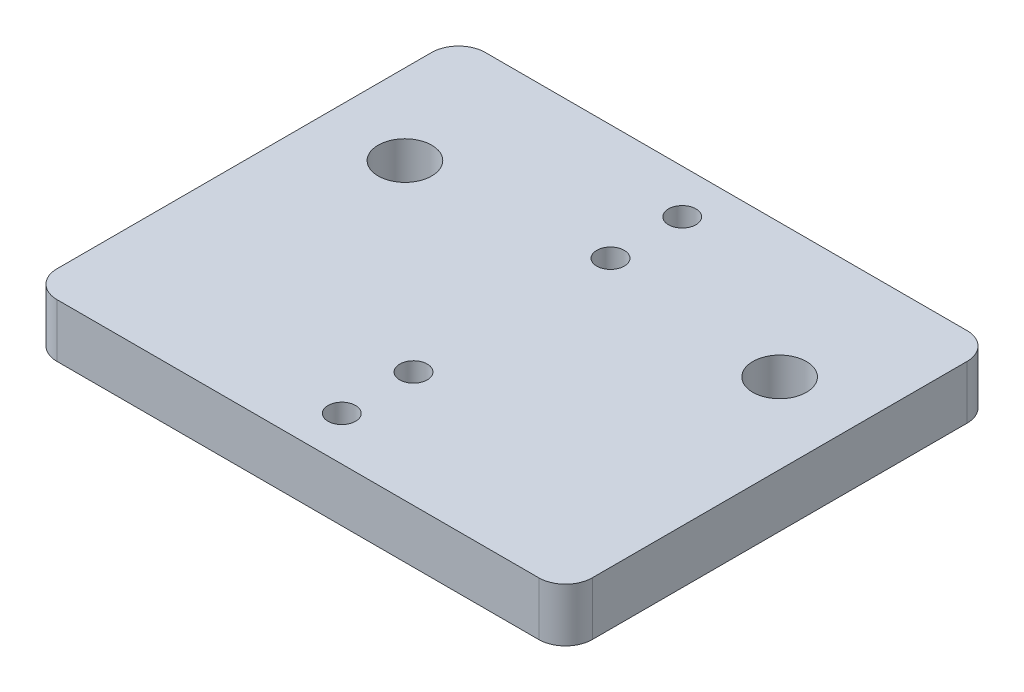
ISO-10303-21;
HEADER;
FILE_DESCRIPTION(('STEP AP214'),'2;1');
FILE_NAME('part.step','',(''),(''),'','','');
FILE_SCHEMA(('AUTOMOTIVE_DESIGN { 1 0 10303 214 1 1 1 1 }'));
ENDSEC;
DATA;
#1=APPLICATION_CONTEXT('core data for automotive mechanical design processes');
#2=APPLICATION_PROTOCOL_DEFINITION('international standard','automotive_design',2000,#1);
#3=PRODUCT_CONTEXT('',#1,'mechanical');
#4=PRODUCT('Part','Part','',(#3));
#5=PRODUCT_RELATED_PRODUCT_CATEGORY('part','',(#4));
#6=PRODUCT_DEFINITION_FORMATION('','',#4);
#7=PRODUCT_DEFINITION_CONTEXT('part definition',#1,'design');
#8=PRODUCT_DEFINITION('design','',#6,#7);
#9=PRODUCT_DEFINITION_SHAPE('','',#8);
#10=(LENGTH_UNIT() NAMED_UNIT(*) SI_UNIT(.MILLI.,.METRE.));
#11=(NAMED_UNIT(*) PLANE_ANGLE_UNIT() SI_UNIT($,.RADIAN.));
#12=(NAMED_UNIT(*) SI_UNIT($,.STERADIAN.) SOLID_ANGLE_UNIT());
#13=UNCERTAINTY_MEASURE_WITH_UNIT(LENGTH_MEASURE(1.E-05),#10,'distance_accuracy_value','');
#14=(GEOMETRIC_REPRESENTATION_CONTEXT(3) GLOBAL_UNCERTAINTY_ASSIGNED_CONTEXT((#13)) GLOBAL_UNIT_ASSIGNED_CONTEXT((#10,
#11,#12)) REPRESENTATION_CONTEXT('',''));
#15=CARTESIAN_POINT('',(0.,0.,0.));
#16=DIRECTION('',(0.,0.,1.));
#17=DIRECTION('',(1.,0.,0.));
#18=AXIS2_PLACEMENT_3D('',#15,#16,#17);
#19=CARTESIAN_POINT('',(0.,6.35,0.));
#20=DIRECTION('',(0.,-1.,0.));
#21=DIRECTION('',(0.,0.,-1.));
#22=AXIS2_PLACEMENT_3D('',#19,#20,#21);
#23=PLANE('',#22);
#24=DIRECTION('',(-1.,0.,0.));
#25=VECTOR('',#24,1.);
#26=CARTESIAN_POINT('',(-63.5,6.35,-50.8));
#27=LINE('',#26,#25);
#28=CARTESIAN_POINT('',(57.15,6.35,-50.8));
#29=VERTEX_POINT('',#28);
#30=CARTESIAN_POINT('',(-57.15,6.35,-50.8));
#31=VERTEX_POINT('',#30);
#32=EDGE_CURVE('E168',#29,#31,#27,.T.);
#33=ORIENTED_EDGE('',*,*,#32,.T.);
#34=CARTESIAN_POINT('',(-57.15,6.35,-44.45));
#35=DIRECTION('',(0.,-1.,0.));
#36=DIRECTION('',(0.,0.,-1.));
#37=AXIS2_PLACEMENT_3D('',#34,#35,#36);
#38=CIRCLE('',#37,6.35);
#39=CARTESIAN_POINT('',(-63.5,6.35,-44.45));
#40=VERTEX_POINT('',#39);
#41=EDGE_CURVE('E146',#31,#40,#38,.F.);
#42=ORIENTED_EDGE('',*,*,#41,.T.);
#43=DIRECTION('',(0.,0.,1.));
#44=VECTOR('',#43,1.);
#45=CARTESIAN_POINT('',(-63.5,6.35,50.8));
#46=LINE('',#45,#44);
#47=CARTESIAN_POINT('',(-63.5,6.35,44.45));
#48=VERTEX_POINT('',#47);
#49=EDGE_CURVE('E116',#40,#48,#46,.T.);
#50=ORIENTED_EDGE('',*,*,#49,.T.);
#51=CARTESIAN_POINT('',(-57.15,6.35,44.45));
#52=DIRECTION('',(0.,-1.,0.));
#53=DIRECTION('',(0.,0.,-1.));
#54=AXIS2_PLACEMENT_3D('',#51,#52,#53);
#55=CIRCLE('',#54,6.35);
#56=CARTESIAN_POINT('',(-57.15,6.35,50.8));
#57=VERTEX_POINT('',#56);
#58=EDGE_CURVE('E52',#48,#57,#55,.F.);
#59=ORIENTED_EDGE('',*,*,#58,.T.);
#60=DIRECTION('',(1.,0.,0.));
#61=VECTOR('',#60,1.);
#62=CARTESIAN_POINT('',(-63.5,6.35,50.8));
#63=LINE('',#62,#61);
#64=CARTESIAN_POINT('',(57.1499999999999,6.35,50.8));
#65=VERTEX_POINT('',#64);
#66=EDGE_CURVE('E132',#57,#65,#63,.T.);
#67=ORIENTED_EDGE('',*,*,#66,.T.);
#68=CARTESIAN_POINT('',(57.15,6.35,44.45));
#69=DIRECTION('',(0.,-1.,0.));
#70=DIRECTION('',(0.,0.,-1.));
#71=AXIS2_PLACEMENT_3D('',#68,#69,#70);
#72=CIRCLE('',#71,6.35);
#73=CARTESIAN_POINT('',(63.5,6.35,44.45));
#74=VERTEX_POINT('',#73);
#75=EDGE_CURVE('E142',#65,#74,#72,.F.);
#76=ORIENTED_EDGE('',*,*,#75,.T.);
#77=DIRECTION('',(0.,0.,-1.));
#78=VECTOR('',#77,1.);
#79=CARTESIAN_POINT('',(63.5,6.35,50.8));
#80=LINE('',#79,#78);
#81=CARTESIAN_POINT('',(63.5,6.35,-44.45));
#82=VERTEX_POINT('',#81);
#83=EDGE_CURVE('E126',#74,#82,#80,.T.);
#84=ORIENTED_EDGE('',*,*,#83,.T.);
#85=CARTESIAN_POINT('',(57.15,6.35,-44.45));
#86=DIRECTION('',(0.,-1.,0.));
#87=DIRECTION('',(0.,0.,-1.));
#88=AXIS2_PLACEMENT_3D('',#85,#86,#87);
#89=CIRCLE('',#88,6.35);
#90=EDGE_CURVE('E144',#82,#29,#89,.F.);
#91=ORIENTED_EDGE('',*,*,#90,.T.);
#92=EDGE_LOOP('',(#33,#42,#50,#59,#67,#76,#84,#91));
#93=FACE_BOUND('',#92,.T.);
#94=CARTESIAN_POINT('',(0.,6.35,-23.368));
#95=DIRECTION('',(0.,1.,0.));
#96=DIRECTION('',(0.,0.,1.));
#97=AXIS2_PLACEMENT_3D('',#94,#95,#96);
#98=CIRCLE('',#97,3.2639);
#99=CARTESIAN_POINT('',(0.,6.35,-20.1041));
#100=VERTEX_POINT('',#99);
#101=EDGE_CURVE('E177',#100,#100,#98,.T.);
#102=ORIENTED_EDGE('',*,*,#101,.F.);
#103=EDGE_LOOP('',(#102));
#104=FACE_BOUND('',#103,.T.);
#105=CARTESIAN_POINT('',(0.,6.35,-40.386));
#106=DIRECTION('',(0.,1.,0.));
#107=DIRECTION('',(0.,0.,1.));
#108=AXIS2_PLACEMENT_3D('',#105,#106,#107);
#109=CIRCLE('',#108,3.2639);
#110=CARTESIAN_POINT('',(0.,6.35,-37.1221));
#111=VERTEX_POINT('',#110);
#112=EDGE_CURVE('E182',#111,#111,#109,.T.);
#113=ORIENTED_EDGE('',*,*,#112,.F.);
#114=EDGE_LOOP('',(#113));
#115=FACE_BOUND('',#114,.T.);
#116=CARTESIAN_POINT('',(0.,6.35,23.368));
#117=DIRECTION('',(0.,1.,0.));
#118=DIRECTION('',(0.,0.,-1.));
#119=AXIS2_PLACEMENT_3D('',#116,#117,#118);
#120=CIRCLE('',#119,3.2639);
#121=CARTESIAN_POINT('',(0.,6.35,20.1041));
#122=VERTEX_POINT('',#121);
#123=EDGE_CURVE('E187',#122,#122,#120,.T.);
#124=ORIENTED_EDGE('',*,*,#123,.F.);
#125=EDGE_LOOP('',(#124));
#126=FACE_BOUND('',#125,.T.);
#127=CARTESIAN_POINT('',(0.,6.35,40.386));
#128=DIRECTION('',(0.,1.,0.));
#129=DIRECTION('',(0.,0.,-1.));
#130=AXIS2_PLACEMENT_3D('',#127,#128,#129);
#131=CIRCLE('',#130,3.2639);
#132=CARTESIAN_POINT('',(0.,6.35,37.1221));
#133=VERTEX_POINT('',#132);
#134=EDGE_CURVE('E193',#133,#133,#131,.T.);
#135=ORIENTED_EDGE('',*,*,#134,.F.);
#136=EDGE_LOOP('',(#135));
#137=FACE_BOUND('',#136,.T.);
#138=CARTESIAN_POINT('',(-44.45,6.35,-19.05));
#139=DIRECTION('',(0.,1.,0.));
#140=DIRECTION('',(0.,0.,1.));
#141=AXIS2_PLACEMENT_3D('',#138,#139,#140);
#142=CIRCLE('',#141,6.35);
#143=CARTESIAN_POINT('',(-44.45,6.35,-12.7));
#144=VERTEX_POINT('',#143);
#145=EDGE_CURVE('E199',#144,#144,#142,.T.);
#146=ORIENTED_EDGE('',*,*,#145,.F.);
#147=EDGE_LOOP('',(#146));
#148=FACE_BOUND('',#147,.T.);
#149=CARTESIAN_POINT('',(44.45,6.35,-19.05));
#150=DIRECTION('',(0.,1.,0.));
#151=DIRECTION('',(0.,0.,1.));
#152=AXIS2_PLACEMENT_3D('',#149,#150,#151);
#153=CIRCLE('',#152,6.35);
#154=CARTESIAN_POINT('',(44.45,6.35,-12.7));
#155=VERTEX_POINT('',#154);
#156=EDGE_CURVE('E205',#155,#155,#153,.T.);
#157=ORIENTED_EDGE('',*,*,#156,.F.);
#158=EDGE_LOOP('',(#157));
#159=FACE_BOUND('',#158,.T.);
#160=ADVANCED_FACE('F32',(#93,#104,#115,#126,#137,#148,#159),#23,.F.);
#161=CARTESIAN_POINT('',(0.,-6.35,0.));
#162=DIRECTION('',(0.,-1.,0.));
#163=DIRECTION('',(0.,0.,-1.));
#164=AXIS2_PLACEMENT_3D('',#161,#162,#163);
#165=PLANE('',#164);
#166=CARTESIAN_POINT('',(-44.45,-6.35,-19.05));
#167=DIRECTION('',(0.,1.,0.));
#168=DIRECTION('',(0.,0.,1.));
#169=AXIS2_PLACEMENT_3D('',#166,#167,#168);
#170=CIRCLE('',#169,6.35);
#171=CARTESIAN_POINT('',(-44.45,-6.35,-12.7));
#172=VERTEX_POINT('',#171);
#173=EDGE_CURVE('E202',#172,#172,#170,.T.);
#174=ORIENTED_EDGE('',*,*,#173,.T.);
#175=EDGE_LOOP('',(#174));
#176=FACE_BOUND('',#175,.T.);
#177=CARTESIAN_POINT('',(0.,-6.35,23.368));
#178=DIRECTION('',(0.,1.,0.));
#179=DIRECTION('',(0.,0.,-1.));
#180=AXIS2_PLACEMENT_3D('',#177,#178,#179);
#181=CIRCLE('',#180,3.2639);
#182=CARTESIAN_POINT('',(0.,-6.35,20.1041));
#183=VERTEX_POINT('',#182);
#184=EDGE_CURVE('E190',#183,#183,#181,.T.);
#185=ORIENTED_EDGE('',*,*,#184,.T.);
#186=EDGE_LOOP('',(#185));
#187=FACE_BOUND('',#186,.T.);
#188=CARTESIAN_POINT('',(0.,-6.35,-23.368));
#189=DIRECTION('',(0.,1.,0.));
#190=DIRECTION('',(0.,0.,1.));
#191=AXIS2_PLACEMENT_3D('',#188,#189,#190);
#192=CIRCLE('',#191,3.2639);
#193=CARTESIAN_POINT('',(0.,-6.35,-20.1041));
#194=VERTEX_POINT('',#193);
#195=EDGE_CURVE('E173',#194,#194,#192,.T.);
#196=ORIENTED_EDGE('',*,*,#195,.T.);
#197=EDGE_LOOP('',(#196));
#198=FACE_BOUND('',#197,.T.);
#199=DIRECTION('',(0.,0.,1.));
#200=VECTOR('',#199,1.);
#201=CARTESIAN_POINT('',(-63.5,-6.35,50.8));
#202=LINE('',#201,#200);
#203=CARTESIAN_POINT('',(-63.5,-6.35,-44.45));
#204=VERTEX_POINT('',#203);
#205=CARTESIAN_POINT('',(-63.5,-6.35,44.45));
#206=VERTEX_POINT('',#205);
#207=EDGE_CURVE('E114',#204,#206,#202,.T.);
#208=ORIENTED_EDGE('',*,*,#207,.F.);
#209=CARTESIAN_POINT('',(-57.15,-6.35,-44.45));
#210=DIRECTION('',(0.,-1.,0.));
#211=DIRECTION('',(0.,0.,-1.));
#212=AXIS2_PLACEMENT_3D('',#209,#210,#211);
#213=CIRCLE('',#212,6.35);
#214=CARTESIAN_POINT('',(-57.15,-6.35,-50.8));
#215=VERTEX_POINT('',#214);
#216=EDGE_CURVE('E97',#204,#215,#213,.T.);
#217=ORIENTED_EDGE('',*,*,#216,.T.);
#218=DIRECTION('',(-1.,0.,0.));
#219=VECTOR('',#218,1.);
#220=CARTESIAN_POINT('',(-63.5,-6.35,-50.8));
#221=LINE('',#220,#219);
#222=CARTESIAN_POINT('',(57.15,-6.35,-50.8));
#223=VERTEX_POINT('',#222);
#224=EDGE_CURVE('E124',#223,#215,#221,.T.);
#225=ORIENTED_EDGE('',*,*,#224,.F.);
#226=CARTESIAN_POINT('',(57.15,-6.35,-44.45));
#227=DIRECTION('',(0.,-1.,0.));
#228=DIRECTION('',(0.,0.,-1.));
#229=AXIS2_PLACEMENT_3D('',#226,#227,#228);
#230=CIRCLE('',#229,6.35);
#231=CARTESIAN_POINT('',(63.5,-6.35,-44.45));
#232=VERTEX_POINT('',#231);
#233=EDGE_CURVE('E108',#223,#232,#230,.T.);
#234=ORIENTED_EDGE('',*,*,#233,.T.);
#235=DIRECTION('',(0.,0.,-1.));
#236=VECTOR('',#235,1.);
#237=CARTESIAN_POINT('',(63.5,-6.35,50.8));
#238=LINE('',#237,#236);
#239=CARTESIAN_POINT('',(63.5,-6.35,44.45));
#240=VERTEX_POINT('',#239);
#241=EDGE_CURVE('E128',#240,#232,#238,.T.);
#242=ORIENTED_EDGE('',*,*,#241,.F.);
#243=CARTESIAN_POINT('',(57.15,-6.35,44.45));
#244=DIRECTION('',(0.,-1.,0.));
#245=DIRECTION('',(0.,0.,-1.));
#246=AXIS2_PLACEMENT_3D('',#243,#244,#245);
#247=CIRCLE('',#246,6.35);
#248=CARTESIAN_POINT('',(57.1499999999999,-6.35,50.8));
#249=VERTEX_POINT('',#248);
#250=EDGE_CURVE('E135',#240,#249,#247,.T.);
#251=ORIENTED_EDGE('',*,*,#250,.T.);
#252=DIRECTION('',(1.,0.,0.));
#253=VECTOR('',#252,1.);
#254=CARTESIAN_POINT('',(-63.5,-6.35,50.8));
#255=LINE('',#254,#253);
#256=CARTESIAN_POINT('',(-57.15,-6.35,50.8));
#257=VERTEX_POINT('',#256);
#258=EDGE_CURVE('E123',#257,#249,#255,.T.);
#259=ORIENTED_EDGE('',*,*,#258,.F.);
#260=CARTESIAN_POINT('',(-57.15,-6.35,44.45));
#261=DIRECTION('',(0.,-1.,0.));
#262=DIRECTION('',(0.,0.,-1.));
#263=AXIS2_PLACEMENT_3D('',#260,#261,#262);
#264=CIRCLE('',#263,6.35);
#265=EDGE_CURVE('E117',#257,#206,#264,.T.);
#266=ORIENTED_EDGE('',*,*,#265,.T.);
#267=EDGE_LOOP('',(#208,#217,#225,#234,#242,#251,#259,#266));
#268=FACE_BOUND('',#267,.T.);
#269=CARTESIAN_POINT('',(0.,-6.35,-40.386));
#270=DIRECTION('',(0.,1.,0.));
#271=DIRECTION('',(0.,0.,1.));
#272=AXIS2_PLACEMENT_3D('',#269,#270,#271);
#273=CIRCLE('',#272,3.2639);
#274=CARTESIAN_POINT('',(0.,-6.35,-37.1221));
#275=VERTEX_POINT('',#274);
#276=EDGE_CURVE('E184',#275,#275,#273,.T.);
#277=ORIENTED_EDGE('',*,*,#276,.T.);
#278=EDGE_LOOP('',(#277));
#279=FACE_BOUND('',#278,.T.);
#280=CARTESIAN_POINT('',(0.,-6.35,40.386));
#281=DIRECTION('',(0.,1.,0.));
#282=DIRECTION('',(0.,0.,-1.));
#283=AXIS2_PLACEMENT_3D('',#280,#281,#282);
#284=CIRCLE('',#283,3.2639);
#285=CARTESIAN_POINT('',(0.,-6.35,37.1221));
#286=VERTEX_POINT('',#285);
#287=EDGE_CURVE('E196',#286,#286,#284,.T.);
#288=ORIENTED_EDGE('',*,*,#287,.T.);
#289=EDGE_LOOP('',(#288));
#290=FACE_BOUND('',#289,.T.);
#291=CARTESIAN_POINT('',(44.45,-6.35,-19.05));
#292=DIRECTION('',(0.,1.,0.));
#293=DIRECTION('',(0.,0.,1.));
#294=AXIS2_PLACEMENT_3D('',#291,#292,#293);
#295=CIRCLE('',#294,6.35);
#296=CARTESIAN_POINT('',(44.45,-6.35,-12.7));
#297=VERTEX_POINT('',#296);
#298=EDGE_CURVE('E208',#297,#297,#295,.T.);
#299=ORIENTED_EDGE('',*,*,#298,.T.);
#300=EDGE_LOOP('',(#299));
#301=FACE_BOUND('',#300,.T.);
#302=ADVANCED_FACE('F120',(#176,#187,#198,#268,#279,#290,#301),#165,.T.);
#303=CARTESIAN_POINT('',(63.5,6.35,50.8));
#304=DIRECTION('',(-1.,0.,0.));
#305=DIRECTION('',(0.,0.,1.));
#306=AXIS2_PLACEMENT_3D('',#303,#304,#305);
#307=PLANE('',#306);
#308=ORIENTED_EDGE('',*,*,#241,.T.);
#309=DIRECTION('',(0.,-1.,0.));
#310=VECTOR('',#309,1.);
#311=CARTESIAN_POINT('',(63.5,6.35,-44.45));
#312=LINE('',#311,#310);
#313=EDGE_CURVE('E151',#232,#82,#312,.F.);
#314=ORIENTED_EDGE('',*,*,#313,.T.);
#315=ORIENTED_EDGE('',*,*,#83,.F.);
#316=DIRECTION('',(0.,-1.,0.));
#317=VECTOR('',#316,1.);
#318=CARTESIAN_POINT('',(63.5,6.35,44.45));
#319=LINE('',#318,#317);
#320=EDGE_CURVE('E148',#74,#240,#319,.T.);
#321=ORIENTED_EDGE('',*,*,#320,.T.);
#322=EDGE_LOOP('',(#308,#314,#315,#321));
#323=FACE_BOUND('',#322,.T.);
#324=ADVANCED_FACE('F164',(#323),#307,.F.);
#325=CARTESIAN_POINT('',(-63.5,6.35,-50.8));
#326=DIRECTION('',(0.,0.,1.));
#327=DIRECTION('',(1.,0.,0.));
#328=AXIS2_PLACEMENT_3D('',#325,#326,#327);
#329=PLANE('',#328);
#330=ORIENTED_EDGE('',*,*,#224,.T.);
#331=DIRECTION('',(0.,-1.,0.));
#332=VECTOR('',#331,1.);
#333=CARTESIAN_POINT('',(-57.15,6.35,-50.8));
#334=LINE('',#333,#332);
#335=EDGE_CURVE('E102',#215,#31,#334,.F.);
#336=ORIENTED_EDGE('',*,*,#335,.T.);
#337=ORIENTED_EDGE('',*,*,#32,.F.);
#338=DIRECTION('',(0.,-1.,0.));
#339=VECTOR('',#338,1.);
#340=CARTESIAN_POINT('',(57.15,6.35,-50.8));
#341=LINE('',#340,#339);
#342=EDGE_CURVE('E107',#29,#223,#341,.T.);
#343=ORIENTED_EDGE('',*,*,#342,.T.);
#344=EDGE_LOOP('',(#330,#336,#337,#343));
#345=FACE_BOUND('',#344,.T.);
#346=ADVANCED_FACE('F233',(#345),#329,.F.);
#347=CARTESIAN_POINT('',(-63.5,6.35,50.8));
#348=DIRECTION('',(1.,0.,0.));
#349=DIRECTION('',(0.,0.,-1.));
#350=AXIS2_PLACEMENT_3D('',#347,#348,#349);
#351=PLANE('',#350);
#352=ORIENTED_EDGE('',*,*,#49,.F.);
#353=DIRECTION('',(0.,-1.,0.));
#354=VECTOR('',#353,1.);
#355=CARTESIAN_POINT('',(-63.5,6.35,-44.45));
#356=LINE('',#355,#354);
#357=EDGE_CURVE('E101',#40,#204,#356,.T.);
#358=ORIENTED_EDGE('',*,*,#357,.T.);
#359=ORIENTED_EDGE('',*,*,#207,.T.);
#360=DIRECTION('',(0.,-1.,0.));
#361=VECTOR('',#360,1.);
#362=CARTESIAN_POINT('',(-63.5,6.35,44.45));
#363=LINE('',#362,#361);
#364=EDGE_CURVE('E118',#206,#48,#363,.F.);
#365=ORIENTED_EDGE('',*,*,#364,.T.);
#366=EDGE_LOOP('',(#352,#358,#359,#365));
#367=FACE_BOUND('',#366,.T.);
#368=ADVANCED_FACE('F113',(#367),#351,.F.);
#369=CARTESIAN_POINT('',(-63.5,6.35,50.8));
#370=DIRECTION('',(0.,0.,-1.));
#371=DIRECTION('',(-1.,0.,0.));
#372=AXIS2_PLACEMENT_3D('',#369,#370,#371);
#373=PLANE('',#372);
#374=ORIENTED_EDGE('',*,*,#258,.T.);
#375=DIRECTION('',(0.,-1.,0.));
#376=VECTOR('',#375,1.);
#377=CARTESIAN_POINT('',(57.15,6.35,50.8));
#378=LINE('',#377,#376);
#379=EDGE_CURVE('E11',#249,#65,#378,.F.);
#380=ORIENTED_EDGE('',*,*,#379,.T.);
#381=ORIENTED_EDGE('',*,*,#66,.F.);
#382=DIRECTION('',(0.,-1.,0.));
#383=VECTOR('',#382,1.);
#384=CARTESIAN_POINT('',(-57.15,6.35,50.8));
#385=LINE('',#384,#383);
#386=EDGE_CURVE('E40',#57,#257,#385,.T.);
#387=ORIENTED_EDGE('',*,*,#386,.T.);
#388=EDGE_LOOP('',(#374,#380,#381,#387));
#389=FACE_BOUND('',#388,.T.);
#390=ADVANCED_FACE('F154',(#389),#373,.F.);
#391=CARTESIAN_POINT('',(0.,6.35,-23.368));
#392=DIRECTION('',(0.,-1.,0.));
#393=DIRECTION('',(0.,0.,-1.));
#394=AXIS2_PLACEMENT_3D('',#391,#392,#393);
#395=CYLINDRICAL_SURFACE('',#394,3.2639);
#396=ORIENTED_EDGE('',*,*,#101,.T.);
#397=EDGE_LOOP('',(#396));
#398=FACE_BOUND('',#397,.T.);
#399=ORIENTED_EDGE('',*,*,#195,.F.);
#400=EDGE_LOOP('',(#399));
#401=FACE_BOUND('',#400,.T.);
#402=ADVANCED_FACE('F226',(#398,#401),#395,.F.);
#403=CARTESIAN_POINT('',(0.,6.35,-40.386));
#404=DIRECTION('',(0.,-1.,0.));
#405=DIRECTION('',(0.,0.,-1.));
#406=AXIS2_PLACEMENT_3D('',#403,#404,#405);
#407=CYLINDRICAL_SURFACE('',#406,3.2639);
#408=ORIENTED_EDGE('',*,*,#112,.T.);
#409=EDGE_LOOP('',(#408));
#410=FACE_BOUND('',#409,.T.);
#411=ORIENTED_EDGE('',*,*,#276,.F.);
#412=EDGE_LOOP('',(#411));
#413=FACE_BOUND('',#412,.T.);
#414=ADVANCED_FACE('F342',(#410,#413),#407,.F.);
#415=CARTESIAN_POINT('',(0.,6.35,23.368));
#416=DIRECTION('',(0.,-1.,0.));
#417=DIRECTION('',(0.,0.,-1.));
#418=AXIS2_PLACEMENT_3D('',#415,#416,#417);
#419=CYLINDRICAL_SURFACE('',#418,3.2639);
#420=ORIENTED_EDGE('',*,*,#123,.T.);
#421=EDGE_LOOP('',(#420));
#422=FACE_BOUND('',#421,.T.);
#423=ORIENTED_EDGE('',*,*,#184,.F.);
#424=EDGE_LOOP('',(#423));
#425=FACE_BOUND('',#424,.T.);
#426=ADVANCED_FACE('F332',(#422,#425),#419,.F.);
#427=CARTESIAN_POINT('',(0.,6.35,40.386));
#428=DIRECTION('',(0.,-1.,0.));
#429=DIRECTION('',(0.,0.,-1.));
#430=AXIS2_PLACEMENT_3D('',#427,#428,#429);
#431=CYLINDRICAL_SURFACE('',#430,3.2639);
#432=ORIENTED_EDGE('',*,*,#134,.T.);
#433=EDGE_LOOP('',(#432));
#434=FACE_BOUND('',#433,.T.);
#435=ORIENTED_EDGE('',*,*,#287,.F.);
#436=EDGE_LOOP('',(#435));
#437=FACE_BOUND('',#436,.T.);
#438=ADVANCED_FACE('F322',(#434,#437),#431,.F.);
#439=CARTESIAN_POINT('',(-44.45,6.35,-19.05));
#440=DIRECTION('',(0.,-1.,0.));
#441=DIRECTION('',(0.,0.,-1.));
#442=AXIS2_PLACEMENT_3D('',#439,#440,#441);
#443=CYLINDRICAL_SURFACE('',#442,6.35);
#444=ORIENTED_EDGE('',*,*,#145,.T.);
#445=EDGE_LOOP('',(#444));
#446=FACE_BOUND('',#445,.T.);
#447=ORIENTED_EDGE('',*,*,#173,.F.);
#448=EDGE_LOOP('',(#447));
#449=FACE_BOUND('',#448,.T.);
#450=ADVANCED_FACE('F313',(#446,#449),#443,.F.);
#451=CARTESIAN_POINT('',(44.45,6.35,-19.05));
#452=DIRECTION('',(0.,-1.,0.));
#453=DIRECTION('',(0.,0.,-1.));
#454=AXIS2_PLACEMENT_3D('',#451,#452,#453);
#455=CYLINDRICAL_SURFACE('',#454,6.35);
#456=ORIENTED_EDGE('',*,*,#156,.T.);
#457=EDGE_LOOP('',(#456));
#458=FACE_BOUND('',#457,.T.);
#459=ORIENTED_EDGE('',*,*,#298,.F.);
#460=EDGE_LOOP('',(#459));
#461=FACE_BOUND('',#460,.T.);
#462=ADVANCED_FACE('F214',(#458,#461),#455,.F.);
#463=CARTESIAN_POINT('',(-57.15,6.35,-44.45));
#464=DIRECTION('',(0.,-1.,0.));
#465=DIRECTION('',(0.,0.,-1.));
#466=AXIS2_PLACEMENT_3D('',#463,#464,#465);
#467=CYLINDRICAL_SURFACE('',#466,6.35);
#468=ORIENTED_EDGE('',*,*,#41,.F.);
#469=ORIENTED_EDGE('',*,*,#335,.F.);
#470=ORIENTED_EDGE('',*,*,#216,.F.);
#471=ORIENTED_EDGE('',*,*,#357,.F.);
#472=EDGE_LOOP('',(#468,#469,#470,#471));
#473=FACE_BOUND('',#472,.T.);
#474=ADVANCED_FACE('F100',(#473),#467,.T.);
#475=CARTESIAN_POINT('',(57.15,6.35,-44.45));
#476=DIRECTION('',(0.,-1.,0.));
#477=DIRECTION('',(0.,0.,-1.));
#478=AXIS2_PLACEMENT_3D('',#475,#476,#477);
#479=CYLINDRICAL_SURFACE('',#478,6.35);
#480=ORIENTED_EDGE('',*,*,#90,.F.);
#481=ORIENTED_EDGE('',*,*,#313,.F.);
#482=ORIENTED_EDGE('',*,*,#233,.F.);
#483=ORIENTED_EDGE('',*,*,#342,.F.);
#484=EDGE_LOOP('',(#480,#481,#482,#483));
#485=FACE_BOUND('',#484,.T.);
#486=ADVANCED_FACE('F241',(#485),#479,.T.);
#487=CARTESIAN_POINT('',(57.15,6.35,44.45));
#488=DIRECTION('',(0.,-1.,0.));
#489=DIRECTION('',(0.,0.,-1.));
#490=AXIS2_PLACEMENT_3D('',#487,#488,#489);
#491=CYLINDRICAL_SURFACE('',#490,6.35);
#492=ORIENTED_EDGE('',*,*,#75,.F.);
#493=ORIENTED_EDGE('',*,*,#379,.F.);
#494=ORIENTED_EDGE('',*,*,#250,.F.);
#495=ORIENTED_EDGE('',*,*,#320,.F.);
#496=EDGE_LOOP('',(#492,#493,#494,#495));
#497=FACE_BOUND('',#496,.T.);
#498=ADVANCED_FACE('F161',(#497),#491,.T.);
#499=CARTESIAN_POINT('',(-57.15,6.35,44.45));
#500=DIRECTION('',(0.,-1.,0.));
#501=DIRECTION('',(0.,0.,-1.));
#502=AXIS2_PLACEMENT_3D('',#499,#500,#501);
#503=CYLINDRICAL_SURFACE('',#502,6.35);
#504=ORIENTED_EDGE('',*,*,#58,.F.);
#505=ORIENTED_EDGE('',*,*,#364,.F.);
#506=ORIENTED_EDGE('',*,*,#265,.F.);
#507=ORIENTED_EDGE('',*,*,#386,.F.);
#508=EDGE_LOOP('',(#504,#505,#506,#507));
#509=FACE_BOUND('',#508,.T.);
#510=ADVANCED_FACE('F34',(#509),#503,.T.);
#511=CLOSED_SHELL('',(#160,#302,#324,#346,#368,#390,#402,#414,#426,#438,#450,#462,#474,#486,
#498,#510));
#512=MANIFOLD_SOLID_BREP('B2',#511);
#513=ADVANCED_BREP_SHAPE_REPRESENTATION('',(#18,#512),#14);
#514=SHAPE_DEFINITION_REPRESENTATION(#9,#513);
ENDSEC;
END-ISO-10303-21;
